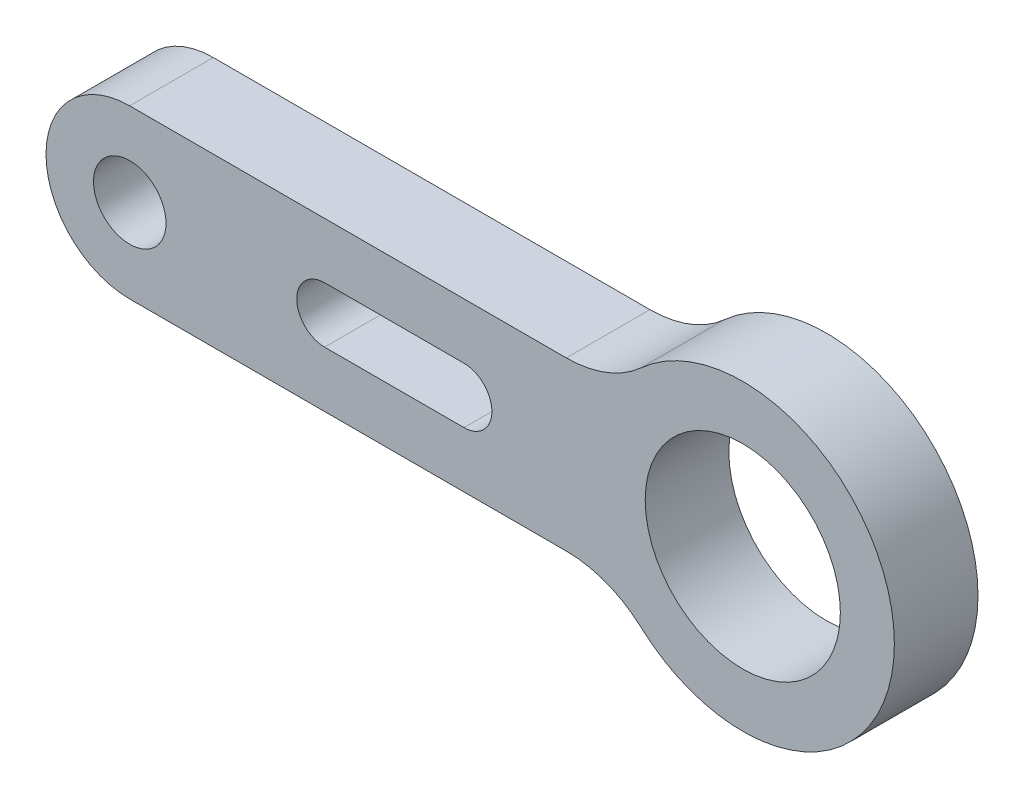
ISO-10303-21;
HEADER;
FILE_DESCRIPTION(('STEP AP214'),'2;1');
FILE_NAME('part.step','',(''),(''),'','','');
FILE_SCHEMA(('AUTOMOTIVE_DESIGN { 1 0 10303 214 1 1 1 1 }'));
ENDSEC;
DATA;
#1=APPLICATION_CONTEXT('core data for automotive mechanical design processes');
#2=APPLICATION_PROTOCOL_DEFINITION('international standard','automotive_design',2000,#1);
#3=PRODUCT_CONTEXT('',#1,'mechanical');
#4=PRODUCT('Part','Part','',(#3));
#5=PRODUCT_RELATED_PRODUCT_CATEGORY('part','',(#4));
#6=PRODUCT_DEFINITION_FORMATION('','',#4);
#7=PRODUCT_DEFINITION_CONTEXT('part definition',#1,'design');
#8=PRODUCT_DEFINITION('design','',#6,#7);
#9=PRODUCT_DEFINITION_SHAPE('','',#8);
#10=(LENGTH_UNIT() NAMED_UNIT(*) SI_UNIT(.MILLI.,.METRE.));
#11=(NAMED_UNIT(*) PLANE_ANGLE_UNIT() SI_UNIT($,.RADIAN.));
#12=(NAMED_UNIT(*) SI_UNIT($,.STERADIAN.) SOLID_ANGLE_UNIT());
#13=UNCERTAINTY_MEASURE_WITH_UNIT(LENGTH_MEASURE(1.E-05),#10,'distance_accuracy_value','');
#14=(GEOMETRIC_REPRESENTATION_CONTEXT(3) GLOBAL_UNCERTAINTY_ASSIGNED_CONTEXT((#13)) GLOBAL_UNIT_ASSIGNED_CONTEXT((#10,
#11,#12)) REPRESENTATION_CONTEXT('',''));
#15=CARTESIAN_POINT('',(0.,0.,0.));
#16=DIRECTION('',(0.,0.,1.));
#17=DIRECTION('',(1.,0.,0.));
#18=AXIS2_PLACEMENT_3D('',#15,#16,#17);
#19=CARTESIAN_POINT('',(17.5427717689708,10.9071198726407,3.));
#20=DIRECTION('',(0.,0.,-1.));
#21=DIRECTION('',(-1.,0.,0.));
#22=AXIS2_PLACEMENT_3D('',#19,#20,#21);
#23=CYLINDRICAL_SURFACE('',#22,3.99999999999998);
#24=CARTESIAN_POINT('',(17.5427717689708,10.9071198726407,0.));
#25=DIRECTION('',(0.,0.,1.));
#26=DIRECTION('',(1.,0.,0.));
#27=AXIS2_PLACEMENT_3D('',#24,#25,#26);
#28=CIRCLE('',#27,3.99999999999998);
#29=CARTESIAN_POINT('',(17.5427717689708,6.90711987264075,0.));
#30=VERTEX_POINT('',#29);
#31=CARTESIAN_POINT('',(20.2258383226541,7.94044599968025,0.));
#32=VERTEX_POINT('',#31);
#33=EDGE_CURVE('E158',#30,#32,#28,.T.);
#34=ORIENTED_EDGE('',*,*,#33,.F.);
#35=DIRECTION('',(0.,0.,-1.));
#36=VECTOR('',#35,1.);
#37=CARTESIAN_POINT('',(17.5427717689708,6.90711987264075,3.));
#38=LINE('',#37,#36);
#39=CARTESIAN_POINT('',(17.5427717689708,6.90711987264075,3.));
#40=VERTEX_POINT('',#39);
#41=EDGE_CURVE('E11',#40,#30,#38,.T.);
#42=ORIENTED_EDGE('',*,*,#41,.F.);
#43=CARTESIAN_POINT('',(17.5427717689708,10.9071198726407,3.));
#44=DIRECTION('',(0.,0.,1.));
#45=DIRECTION('',(1.,0.,0.));
#46=AXIS2_PLACEMENT_3D('',#43,#44,#45);
#47=CIRCLE('',#46,3.99999999999998);
#48=CARTESIAN_POINT('',(20.2258383226541,7.94044599968025,3.));
#49=VERTEX_POINT('',#48);
#50=EDGE_CURVE('E161',#40,#49,#47,.T.);
#51=ORIENTED_EDGE('',*,*,#50,.T.);
#52=DIRECTION('',(0.,0.,-1.));
#53=VECTOR('',#52,1.);
#54=CARTESIAN_POINT('',(20.2258383226541,7.94044599968025,3.));
#55=LINE('',#54,#53);
#56=EDGE_CURVE('E40',#49,#32,#55,.T.);
#57=ORIENTED_EDGE('',*,*,#56,.T.);
#58=EDGE_LOOP('',(#34,#42,#51,#57));
#59=FACE_BOUND('',#58,.T.);
#60=ADVANCED_FACE('F37',(#59),#23,.F.);
#61=CARTESIAN_POINT('',(1.87979368641482,6.90711987264075,3.));
#62=DIRECTION('',(0.,1.,0.));
#63=DIRECTION('',(0.,0.,1.));
#64=AXIS2_PLACEMENT_3D('',#61,#62,#63);
#65=PLANE('',#64);
#66=DIRECTION('',(1.,0.,0.));
#67=VECTOR('',#66,1.);
#68=CARTESIAN_POINT('',(1.87979368641482,6.90711987264075,0.));
#69=LINE('',#68,#67);
#70=CARTESIAN_POINT('',(1.87979368641482,6.90711987264075,0.));
#71=VERTEX_POINT('',#70);
#72=EDGE_CURVE('E165',#71,#30,#69,.T.);
#73=ORIENTED_EDGE('',*,*,#72,.F.);
#74=DIRECTION('',(0.,0.,-1.));
#75=VECTOR('',#74,1.);
#76=CARTESIAN_POINT('',(1.87979368641482,6.90711987264075,3.));
#77=LINE('',#76,#75);
#78=CARTESIAN_POINT('',(1.87979368641482,6.90711987264075,3.));
#79=VERTEX_POINT('',#78);
#80=EDGE_CURVE('E45',#79,#71,#77,.T.);
#81=ORIENTED_EDGE('',*,*,#80,.F.);
#82=DIRECTION('',(1.,0.,0.));
#83=VECTOR('',#82,1.);
#84=CARTESIAN_POINT('',(1.87979368641482,6.90711987264075,3.));
#85=LINE('',#84,#83);
#86=EDGE_CURVE('E177',#79,#40,#85,.T.);
#87=ORIENTED_EDGE('',*,*,#86,.T.);
#88=ORIENTED_EDGE('',*,*,#41,.T.);
#89=EDGE_LOOP('',(#73,#81,#87,#88));
#90=FACE_BOUND('',#89,.T.);
#91=ADVANCED_FACE('F214',(#90),#65,.T.);
#92=CARTESIAN_POINT('',(1.87979368641482,3.90711987264075,3.));
#93=DIRECTION('',(0.,0.,-1.));
#94=DIRECTION('',(-1.,0.,0.));
#95=AXIS2_PLACEMENT_3D('',#92,#93,#94);
#96=CYLINDRICAL_SURFACE('',#95,3.);
#97=CARTESIAN_POINT('',(1.87979368641482,3.90711987264075,0.));
#98=DIRECTION('',(0.,0.,-1.));
#99=DIRECTION('',(-1.,0.,0.));
#100=AXIS2_PLACEMENT_3D('',#97,#98,#99);
#101=CIRCLE('',#100,3.);
#102=CARTESIAN_POINT('',(1.87979368641482,0.907119872640748,0.));
#103=VERTEX_POINT('',#102);
#104=EDGE_CURVE('E191',#103,#71,#101,.T.);
#105=ORIENTED_EDGE('',*,*,#104,.F.);
#106=DIRECTION('',(0.,0.,-1.));
#107=VECTOR('',#106,1.);
#108=CARTESIAN_POINT('',(1.87979368641482,0.907119872640748,3.));
#109=LINE('',#108,#107);
#110=CARTESIAN_POINT('',(1.87979368641482,0.907119872640748,3.));
#111=VERTEX_POINT('',#110);
#112=EDGE_CURVE('E197',#111,#103,#109,.T.);
#113=ORIENTED_EDGE('',*,*,#112,.F.);
#114=CARTESIAN_POINT('',(1.87979368641482,3.90711987264075,3.));
#115=DIRECTION('',(0.,0.,-1.));
#116=DIRECTION('',(-1.,0.,0.));
#117=AXIS2_PLACEMENT_3D('',#114,#115,#116);
#118=CIRCLE('',#117,3.);
#119=EDGE_CURVE('E174',#111,#79,#118,.T.);
#120=ORIENTED_EDGE('',*,*,#119,.T.);
#121=ORIENTED_EDGE('',*,*,#80,.T.);
#122=EDGE_LOOP('',(#105,#113,#120,#121));
#123=FACE_BOUND('',#122,.T.);
#124=ADVANCED_FACE('F226',(#123),#96,.T.);
#125=CARTESIAN_POINT('',(17.5441377186444,0.907119872640744,3.));
#126=DIRECTION('',(0.,-1.,0.));
#127=DIRECTION('',(1.,0.,0.));
#128=AXIS2_PLACEMENT_3D('',#125,#126,#127);
#129=PLANE('',#128);
#130=DIRECTION('',(-1.,0.,0.));
#131=VECTOR('',#130,1.);
#132=CARTESIAN_POINT('',(17.5441377186444,0.907119872640744,0.));
#133=LINE('',#132,#131);
#134=CARTESIAN_POINT('',(17.5441377186444,0.907119872640744,0.));
#135=VERTEX_POINT('',#134);
#136=EDGE_CURVE('E188',#135,#103,#133,.T.);
#137=ORIENTED_EDGE('',*,*,#136,.F.);
#138=DIRECTION('',(0.,0.,-1.));
#139=VECTOR('',#138,1.);
#140=CARTESIAN_POINT('',(17.5441377186444,0.907119872640744,3.));
#141=LINE('',#140,#139);
#142=CARTESIAN_POINT('',(17.5441377186444,0.907119872640744,3.));
#143=VERTEX_POINT('',#142);
#144=EDGE_CURVE('E199',#143,#135,#141,.T.);
#145=ORIENTED_EDGE('',*,*,#144,.F.);
#146=DIRECTION('',(-1.,0.,0.));
#147=VECTOR('',#146,1.);
#148=CARTESIAN_POINT('',(17.5441377186444,0.907119872640744,3.));
#149=LINE('',#148,#147);
#150=EDGE_CURVE('E171',#143,#111,#149,.T.);
#151=ORIENTED_EDGE('',*,*,#150,.T.);
#152=ORIENTED_EDGE('',*,*,#112,.T.);
#153=EDGE_LOOP('',(#137,#145,#151,#152));
#154=FACE_BOUND('',#153,.T.);
#155=ADVANCED_FACE('F224',(#154),#129,.T.);
#156=CARTESIAN_POINT('',(17.5441377186444,-3.09288012735926,3.));
#157=DIRECTION('',(0.,0.,-1.));
#158=DIRECTION('',(-1.,0.,0.));
#159=AXIS2_PLACEMENT_3D('',#156,#157,#158);
#160=CYLINDRICAL_SURFACE('',#159,4.00000000000001);
#161=CARTESIAN_POINT('',(17.5441377186444,-3.09288012735926,0.));
#162=DIRECTION('',(0.,0.,1.));
#163=DIRECTION('',(1.,0.,0.));
#164=AXIS2_PLACEMENT_3D('',#161,#162,#163);
#165=CIRCLE('',#164,4.00000000000001);
#166=CARTESIAN_POINT('',(20.2266253173634,-0.125682748902823,0.));
#167=VERTEX_POINT('',#166);
#168=EDGE_CURVE('E185',#167,#135,#165,.T.);
#169=ORIENTED_EDGE('',*,*,#168,.F.);
#170=DIRECTION('',(0.,0.,-1.));
#171=VECTOR('',#170,1.);
#172=CARTESIAN_POINT('',(20.2266253173634,-0.125682748902823,3.));
#173=LINE('',#172,#171);
#174=CARTESIAN_POINT('',(20.2266253173634,-0.125682748902823,3.));
#175=VERTEX_POINT('',#174);
#176=EDGE_CURVE('E200',#175,#167,#173,.T.);
#177=ORIENTED_EDGE('',*,*,#176,.F.);
#178=CARTESIAN_POINT('',(17.5441377186444,-3.09288012735926,3.));
#179=DIRECTION('',(0.,0.,1.));
#180=DIRECTION('',(1.,0.,0.));
#181=AXIS2_PLACEMENT_3D('',#178,#179,#180);
#182=CIRCLE('',#181,4.00000000000001);
#183=EDGE_CURVE('E168',#175,#143,#182,.T.);
#184=ORIENTED_EDGE('',*,*,#183,.T.);
#185=ORIENTED_EDGE('',*,*,#144,.T.);
#186=EDGE_LOOP('',(#169,#177,#184,#185));
#187=FACE_BOUND('',#186,.T.);
#188=ADVANCED_FACE('F221',(#187),#160,.F.);
#189=CARTESIAN_POINT('',(23.8730290597059,3.9077374354958,3.));
#190=DIRECTION('',(0.,0.,-1.));
#191=DIRECTION('',(-1.,0.,0.));
#192=AXIS2_PLACEMENT_3D('',#189,#190,#191);
#193=CYLINDRICAL_SURFACE('',#192,5.43734665402928);
#194=CARTESIAN_POINT('',(23.8730290597059,3.9077374354958,0.));
#195=DIRECTION('',(0.,0.,-1.));
#196=DIRECTION('',(-1.,0.,0.));
#197=AXIS2_PLACEMENT_3D('',#194,#195,#196);
#198=CIRCLE('',#197,5.43734665402928);
#199=EDGE_CURVE('E182',#32,#167,#198,.T.);
#200=ORIENTED_EDGE('',*,*,#199,.F.);
#201=ORIENTED_EDGE('',*,*,#56,.F.);
#202=CARTESIAN_POINT('',(23.8730290597059,3.9077374354958,3.));
#203=DIRECTION('',(0.,0.,-1.));
#204=DIRECTION('',(-1.,0.,0.));
#205=AXIS2_PLACEMENT_3D('',#202,#203,#204);
#206=CIRCLE('',#205,5.43734665402928);
#207=EDGE_CURVE('E164',#49,#175,#206,.T.);
#208=ORIENTED_EDGE('',*,*,#207,.T.);
#209=ORIENTED_EDGE('',*,*,#176,.T.);
#210=EDGE_LOOP('',(#200,#201,#208,#209));
#211=FACE_BOUND('',#210,.T.);
#212=ADVANCED_FACE('F208',(#211),#193,.T.);
#213=CARTESIAN_POINT('',(17.5427717689708,10.9071198726407,3.));
#214=DIRECTION('',(0.,0.,1.));
#215=DIRECTION('',(1.,0.,0.));
#216=AXIS2_PLACEMENT_3D('',#213,#214,#215);
#217=PLANE('',#216);
#218=CARTESIAN_POINT('',(23.8730290597059,3.9077374354958,3.));
#219=DIRECTION('',(0.,0.,-1.));
#220=DIRECTION('',(1.,0.,0.));
#221=AXIS2_PLACEMENT_3D('',#218,#219,#220);
#222=CIRCLE('',#221,3.5);
#223=CARTESIAN_POINT('',(27.3730290597059,3.9077374354958,3.));
#224=VERTEX_POINT('',#223);
#225=EDGE_CURVE('E145',#224,#224,#222,.T.);
#226=ORIENTED_EDGE('',*,*,#225,.T.);
#227=EDGE_LOOP('',(#226));
#228=FACE_BOUND('',#227,.T.);
#229=CARTESIAN_POINT('',(8.87402905970584,3.90738649708881,3.));
#230=DIRECTION('',(0.,0.,-1.));
#231=DIRECTION('',(1.,0.,0.));
#232=AXIS2_PLACEMENT_3D('',#229,#230,#231);
#233=CIRCLE('',#232,1.);
#234=CARTESIAN_POINT('',(8.87402905970584,2.90738649708881,3.));
#235=VERTEX_POINT('',#234);
#236=CARTESIAN_POINT('',(8.87402905970584,4.90738649708881,3.));
#237=VERTEX_POINT('',#236);
#238=EDGE_CURVE('E116',#235,#237,#233,.T.);
#239=ORIENTED_EDGE('',*,*,#238,.T.);
#240=DIRECTION('',(1.,0.,0.));
#241=VECTOR('',#240,1.);
#242=CARTESIAN_POINT('',(13.8740290597058,4.90738649708881,3.));
#243=LINE('',#242,#241);
#244=CARTESIAN_POINT('',(13.8740290597058,4.90738649708881,3.));
#245=VERTEX_POINT('',#244);
#246=EDGE_CURVE('E125',#237,#245,#243,.T.);
#247=ORIENTED_EDGE('',*,*,#246,.T.);
#248=CARTESIAN_POINT('',(13.8740290597058,3.90738649708881,3.));
#249=DIRECTION('',(0.,0.,-1.));
#250=DIRECTION('',(1.,0.,0.));
#251=AXIS2_PLACEMENT_3D('',#248,#249,#250);
#252=CIRCLE('',#251,1.);
#253=CARTESIAN_POINT('',(13.8740290597058,2.90738649708881,3.));
#254=VERTEX_POINT('',#253);
#255=EDGE_CURVE('E53',#245,#254,#252,.T.);
#256=ORIENTED_EDGE('',*,*,#255,.T.);
#257=DIRECTION('',(-1.,0.,0.));
#258=VECTOR('',#257,1.);
#259=CARTESIAN_POINT('',(8.87402905970584,2.90738649708881,3.));
#260=LINE('',#259,#258);
#261=EDGE_CURVE('E122',#254,#235,#260,.T.);
#262=ORIENTED_EDGE('',*,*,#261,.T.);
#263=EDGE_LOOP('',(#239,#247,#256,#262));
#264=FACE_BOUND('',#263,.T.);
#265=CARTESIAN_POINT('',(1.8840290597058,3.90711987264075,3.));
#266=DIRECTION('',(0.,0.,-1.));
#267=DIRECTION('',(1.,0.,0.));
#268=AXIS2_PLACEMENT_3D('',#265,#266,#267);
#269=CIRCLE('',#268,1.3);
#270=CARTESIAN_POINT('',(3.1840290597058,3.90711987264075,3.));
#271=VERTEX_POINT('',#270);
#272=EDGE_CURVE('E155',#271,#271,#269,.T.);
#273=ORIENTED_EDGE('',*,*,#272,.T.);
#274=EDGE_LOOP('',(#273));
#275=FACE_BOUND('',#274,.T.);
#276=ORIENTED_EDGE('',*,*,#50,.F.);
#277=ORIENTED_EDGE('',*,*,#86,.F.);
#278=ORIENTED_EDGE('',*,*,#119,.F.);
#279=ORIENTED_EDGE('',*,*,#150,.F.);
#280=ORIENTED_EDGE('',*,*,#183,.F.);
#281=ORIENTED_EDGE('',*,*,#207,.F.);
#282=EDGE_LOOP('',(#276,#277,#278,#279,#280,#281));
#283=FACE_BOUND('',#282,.T.);
#284=ADVANCED_FACE('F129',(#228,#264,#275,#283),#217,.T.);
#285=CARTESIAN_POINT('',(17.5427717689708,10.9071198726407,0.));
#286=DIRECTION('',(0.,0.,1.));
#287=DIRECTION('',(1.,0.,0.));
#288=AXIS2_PLACEMENT_3D('',#285,#286,#287);
#289=PLANE('',#288);
#290=CARTESIAN_POINT('',(23.8730290597059,3.9077374354958,0.));
#291=DIRECTION('',(0.,0.,-1.));
#292=DIRECTION('',(1.,0.,0.));
#293=AXIS2_PLACEMENT_3D('',#290,#291,#292);
#294=CIRCLE('',#293,3.5);
#295=CARTESIAN_POINT('',(27.3730290597059,3.9077374354958,0.));
#296=VERTEX_POINT('',#295);
#297=EDGE_CURVE('E138',#296,#296,#294,.T.);
#298=ORIENTED_EDGE('',*,*,#297,.F.);
#299=EDGE_LOOP('',(#298));
#300=FACE_BOUND('',#299,.T.);
#301=DIRECTION('',(1.,0.,0.));
#302=VECTOR('',#301,1.);
#303=CARTESIAN_POINT('',(13.8740290597058,4.90738649708881,0.));
#304=LINE('',#303,#302);
#305=CARTESIAN_POINT('',(8.87402905970584,4.90738649708881,0.));
#306=VERTEX_POINT('',#305);
#307=CARTESIAN_POINT('',(13.8740290597058,4.90738649708881,0.));
#308=VERTEX_POINT('',#307);
#309=EDGE_CURVE('E144',#306,#308,#304,.T.);
#310=ORIENTED_EDGE('',*,*,#309,.F.);
#311=CARTESIAN_POINT('',(8.87402905970584,3.90738649708881,0.));
#312=DIRECTION('',(0.,0.,-1.));
#313=DIRECTION('',(1.,0.,0.));
#314=AXIS2_PLACEMENT_3D('',#311,#312,#313);
#315=CIRCLE('',#314,1.);
#316=CARTESIAN_POINT('',(8.87402905970584,2.90738649708881,0.));
#317=VERTEX_POINT('',#316);
#318=EDGE_CURVE('E61',#317,#306,#315,.T.);
#319=ORIENTED_EDGE('',*,*,#318,.F.);
#320=DIRECTION('',(-1.,0.,0.));
#321=VECTOR('',#320,1.);
#322=CARTESIAN_POINT('',(8.87402905970584,2.90738649708881,0.));
#323=LINE('',#322,#321);
#324=CARTESIAN_POINT('',(13.8740290597058,2.90738649708881,0.));
#325=VERTEX_POINT('',#324);
#326=EDGE_CURVE('E132',#325,#317,#323,.T.);
#327=ORIENTED_EDGE('',*,*,#326,.F.);
#328=CARTESIAN_POINT('',(13.8740290597058,3.90738649708881,0.));
#329=DIRECTION('',(0.,0.,-1.));
#330=DIRECTION('',(1.,0.,0.));
#331=AXIS2_PLACEMENT_3D('',#328,#329,#330);
#332=CIRCLE('',#331,1.);
#333=EDGE_CURVE('E135',#308,#325,#332,.T.);
#334=ORIENTED_EDGE('',*,*,#333,.F.);
#335=EDGE_LOOP('',(#310,#319,#327,#334));
#336=FACE_BOUND('',#335,.T.);
#337=CARTESIAN_POINT('',(1.8840290597058,3.90711987264075,0.));
#338=DIRECTION('',(0.,0.,-1.));
#339=DIRECTION('',(1.,0.,0.));
#340=AXIS2_PLACEMENT_3D('',#337,#338,#339);
#341=CIRCLE('',#340,1.3);
#342=CARTESIAN_POINT('',(3.1840290597058,3.90711987264075,0.));
#343=VERTEX_POINT('',#342);
#344=EDGE_CURVE('E151',#343,#343,#341,.T.);
#345=ORIENTED_EDGE('',*,*,#344,.F.);
#346=EDGE_LOOP('',(#345));
#347=FACE_BOUND('',#346,.T.);
#348=ORIENTED_EDGE('',*,*,#33,.T.);
#349=ORIENTED_EDGE('',*,*,#199,.T.);
#350=ORIENTED_EDGE('',*,*,#168,.T.);
#351=ORIENTED_EDGE('',*,*,#136,.T.);
#352=ORIENTED_EDGE('',*,*,#104,.T.);
#353=ORIENTED_EDGE('',*,*,#72,.T.);
#354=EDGE_LOOP('',(#348,#349,#350,#351,#352,#353));
#355=FACE_BOUND('',#354,.T.);
#356=ADVANCED_FACE('F210',(#300,#336,#347,#355),#289,.F.);
#357=CARTESIAN_POINT('',(1.8840290597058,3.90711987264075,3.));
#358=DIRECTION('',(0.,0.,-1.));
#359=DIRECTION('',(-1.,0.,0.));
#360=AXIS2_PLACEMENT_3D('',#357,#358,#359);
#361=CYLINDRICAL_SURFACE('',#360,1.3);
#362=ORIENTED_EDGE('',*,*,#272,.F.);
#363=EDGE_LOOP('',(#362));
#364=FACE_BOUND('',#363,.T.);
#365=ORIENTED_EDGE('',*,*,#344,.T.);
#366=EDGE_LOOP('',(#365));
#367=FACE_BOUND('',#366,.T.);
#368=ADVANCED_FACE('F285',(#364,#367),#361,.F.);
#369=CARTESIAN_POINT('',(8.87402905970584,3.90738649708881,3.));
#370=DIRECTION('',(0.,0.,-1.));
#371=DIRECTION('',(-1.,0.,0.));
#372=AXIS2_PLACEMENT_3D('',#369,#370,#371);
#373=CYLINDRICAL_SURFACE('',#372,1.);
#374=ORIENTED_EDGE('',*,*,#318,.T.);
#375=DIRECTION('',(0.,0.,-1.));
#376=VECTOR('',#375,1.);
#377=CARTESIAN_POINT('',(8.87402905970584,4.90738649708881,3.));
#378=LINE('',#377,#376);
#379=EDGE_CURVE('E112',#237,#306,#378,.T.);
#380=ORIENTED_EDGE('',*,*,#379,.F.);
#381=ORIENTED_EDGE('',*,*,#238,.F.);
#382=DIRECTION('',(0.,0.,-1.));
#383=VECTOR('',#382,1.);
#384=CARTESIAN_POINT('',(8.87402905970584,2.90738649708881,3.));
#385=LINE('',#384,#383);
#386=EDGE_CURVE('E149',#235,#317,#385,.T.);
#387=ORIENTED_EDGE('',*,*,#386,.T.);
#388=EDGE_LOOP('',(#374,#380,#381,#387));
#389=FACE_BOUND('',#388,.T.);
#390=ADVANCED_FACE('F114',(#389),#373,.F.);
#391=CARTESIAN_POINT('',(8.87402905970584,2.90738649708881,3.));
#392=DIRECTION('',(0.,-1.,0.));
#393=DIRECTION('',(0.,0.,-1.));
#394=AXIS2_PLACEMENT_3D('',#391,#392,#393);
#395=PLANE('',#394);
#396=ORIENTED_EDGE('',*,*,#326,.T.);
#397=ORIENTED_EDGE('',*,*,#386,.F.);
#398=ORIENTED_EDGE('',*,*,#261,.F.);
#399=DIRECTION('',(0.,0.,-1.));
#400=VECTOR('',#399,1.);
#401=CARTESIAN_POINT('',(13.8740290597058,2.90738649708881,3.));
#402=LINE('',#401,#400);
#403=EDGE_CURVE('E152',#254,#325,#402,.T.);
#404=ORIENTED_EDGE('',*,*,#403,.T.);
#405=EDGE_LOOP('',(#396,#397,#398,#404));
#406=FACE_BOUND('',#405,.T.);
#407=ADVANCED_FACE('F304',(#406),#395,.F.);
#408=CARTESIAN_POINT('',(13.8740290597058,3.90738649708881,3.));
#409=DIRECTION('',(0.,0.,-1.));
#410=DIRECTION('',(-1.,0.,0.));
#411=AXIS2_PLACEMENT_3D('',#408,#409,#410);
#412=CYLINDRICAL_SURFACE('',#411,1.);
#413=ORIENTED_EDGE('',*,*,#333,.T.);
#414=ORIENTED_EDGE('',*,*,#403,.F.);
#415=ORIENTED_EDGE('',*,*,#255,.F.);
#416=DIRECTION('',(0.,0.,-1.));
#417=VECTOR('',#416,1.);
#418=CARTESIAN_POINT('',(13.8740290597058,4.90738649708881,3.));
#419=LINE('',#418,#417);
#420=EDGE_CURVE('E121',#245,#308,#419,.T.);
#421=ORIENTED_EDGE('',*,*,#420,.T.);
#422=EDGE_LOOP('',(#413,#414,#415,#421));
#423=FACE_BOUND('',#422,.T.);
#424=ADVANCED_FACE('F313',(#423),#412,.F.);
#425=CARTESIAN_POINT('',(13.8740290597058,4.90738649708881,3.));
#426=DIRECTION('',(0.,1.,0.));
#427=DIRECTION('',(0.,0.,1.));
#428=AXIS2_PLACEMENT_3D('',#425,#426,#427);
#429=PLANE('',#428);
#430=ORIENTED_EDGE('',*,*,#309,.T.);
#431=ORIENTED_EDGE('',*,*,#420,.F.);
#432=ORIENTED_EDGE('',*,*,#246,.F.);
#433=ORIENTED_EDGE('',*,*,#379,.T.);
#434=EDGE_LOOP('',(#430,#431,#432,#433));
#435=FACE_BOUND('',#434,.T.);
#436=ADVANCED_FACE('F126',(#435),#429,.F.);
#437=CARTESIAN_POINT('',(23.8730290597059,3.9077374354958,3.));
#438=DIRECTION('',(0.,0.,-1.));
#439=DIRECTION('',(-1.,0.,0.));
#440=AXIS2_PLACEMENT_3D('',#437,#438,#439);
#441=CYLINDRICAL_SURFACE('',#440,3.5);
#442=ORIENTED_EDGE('',*,*,#225,.F.);
#443=EDGE_LOOP('',(#442));
#444=FACE_BOUND('',#443,.T.);
#445=ORIENTED_EDGE('',*,*,#297,.T.);
#446=EDGE_LOOP('',(#445));
#447=FACE_BOUND('',#446,.T.);
#448=ADVANCED_FACE('F331',(#444,#447),#441,.F.);
#449=CLOSED_SHELL('',(#60,#91,#124,#155,#188,#212,#284,#356,#368,#390,#407,#424,#436,#448));
#450=MANIFOLD_SOLID_BREP('B2',#449);
#451=ADVANCED_BREP_SHAPE_REPRESENTATION('',(#18,#450),#14);
#452=SHAPE_DEFINITION_REPRESENTATION(#9,#451);
ENDSEC;
END-ISO-10303-21;
